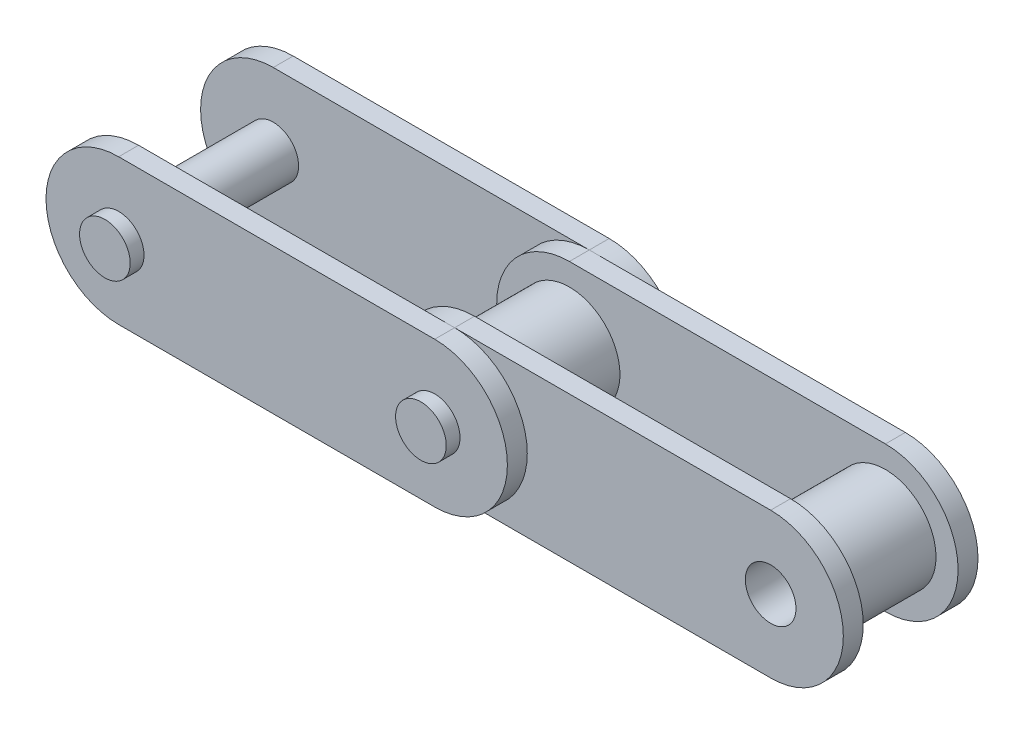
ISO-10303-21;
HEADER;
FILE_DESCRIPTION(('STEP AP214'),'2;1');
FILE_NAME('part.step','',(''),(''),'','','');
FILE_SCHEMA(('AUTOMOTIVE_DESIGN { 1 0 10303 214 1 1 1 1 }'));
ENDSEC;
DATA;
#1=APPLICATION_CONTEXT('core data for automotive mechanical design processes');
#2=APPLICATION_PROTOCOL_DEFINITION('international standard','automotive_design',2000,#1);
#3=PRODUCT_CONTEXT('',#1,'mechanical');
#4=PRODUCT('Part','Part','',(#3));
#5=PRODUCT_RELATED_PRODUCT_CATEGORY('part','',(#4));
#6=PRODUCT_DEFINITION_FORMATION('','',#4);
#7=PRODUCT_DEFINITION_CONTEXT('part definition',#1,'design');
#8=PRODUCT_DEFINITION('design','',#6,#7);
#9=PRODUCT_DEFINITION_SHAPE('','',#8);
#10=(LENGTH_UNIT() NAMED_UNIT(*) SI_UNIT(.MILLI.,.METRE.));
#11=(NAMED_UNIT(*) PLANE_ANGLE_UNIT() SI_UNIT($,.RADIAN.));
#12=(NAMED_UNIT(*) SI_UNIT($,.STERADIAN.) SOLID_ANGLE_UNIT());
#13=UNCERTAINTY_MEASURE_WITH_UNIT(LENGTH_MEASURE(1.E-05),#10,'distance_accuracy_value','');
#14=(GEOMETRIC_REPRESENTATION_CONTEXT(3) GLOBAL_UNCERTAINTY_ASSIGNED_CONTEXT((#13)) GLOBAL_UNIT_ASSIGNED_CONTEXT((#10,
#11,#12)) REPRESENTATION_CONTEXT('',''));
#15=CARTESIAN_POINT('',(0.,0.,0.));
#16=DIRECTION('',(0.,0.,1.));
#17=DIRECTION('',(1.,0.,0.));
#18=AXIS2_PLACEMENT_3D('',#15,#16,#17);
#19=CARTESIAN_POINT('',(698.5,0.,10.15));
#20=DIRECTION('',(0.,0.,-1.));
#21=DIRECTION('',(-1.,0.,0.));
#22=AXIS2_PLACEMENT_3D('',#19,#20,#21);
#23=PLANE('',#22);
#24=CARTESIAN_POINT('',(730.25,0.,10.15));
#25=DIRECTION('',(0.,0.,-1.));
#26=DIRECTION('',(-1.,0.,0.));
#27=AXIS2_PLACEMENT_3D('',#24,#25,#26);
#28=CIRCLE('',#27,2.545);
#29=CARTESIAN_POINT('',(727.705,0.,10.15));
#30=VERTEX_POINT('',#29);
#31=EDGE_CURVE('E20',#30,#30,#28,.T.);
#32=ORIENTED_EDGE('',*,*,#31,.F.);
#33=EDGE_LOOP('',(#32));
#34=FACE_BOUND('',#33,.T.);
#35=ADVANCED_FACE('F17',(#34),#23,.F.);
#36=CARTESIAN_POINT('',(698.5,0.,10.15));
#37=DIRECTION('',(0.,0.,-1.));
#38=DIRECTION('',(-1.,0.,0.));
#39=AXIS2_PLACEMENT_3D('',#36,#37,#38);
#40=PLANE('',#39);
#41=CARTESIAN_POINT('',(698.5,0.,10.15));
#42=DIRECTION('',(0.,0.,1.));
#43=DIRECTION('',(1.,0.,0.));
#44=AXIS2_PLACEMENT_3D('',#41,#42,#43);
#45=CIRCLE('',#44,2.545);
#46=CARTESIAN_POINT('',(701.045,0.,10.15));
#47=VERTEX_POINT('',#46);
#48=EDGE_CURVE('E256',#47,#47,#45,.F.);
#49=ORIENTED_EDGE('',*,*,#48,.F.);
#50=EDGE_LOOP('',(#49));
#51=FACE_BOUND('',#50,.T.);
#52=ADVANCED_FACE('F269',(#51),#40,.F.);
#53=CARTESIAN_POINT('',(730.25,0.,0.));
#54=DIRECTION('',(0.,0.,-1.));
#55=DIRECTION('',(-1.,0.,0.));
#56=AXIS2_PLACEMENT_3D('',#53,#54,#55);
#57=CYLINDRICAL_SURFACE('',#56,2.545);
#58=CARTESIAN_POINT('',(730.25,0.,8.765));
#59=DIRECTION('',(0.,0.,-1.));
#60=DIRECTION('',(-1.,0.,0.));
#61=AXIS2_PLACEMENT_3D('',#58,#59,#60);
#62=CIRCLE('',#61,2.545);
#63=CARTESIAN_POINT('',(727.705,0.,8.765));
#64=VERTEX_POINT('',#63);
#65=EDGE_CURVE('E254',#64,#64,#62,.F.);
#66=ORIENTED_EDGE('',*,*,#65,.T.);
#67=EDGE_LOOP('',(#66));
#68=FACE_BOUND('',#67,.T.);
#69=ORIENTED_EDGE('',*,*,#31,.T.);
#70=EDGE_LOOP('',(#69));
#71=FACE_BOUND('',#70,.T.);
#72=ADVANCED_FACE('F266',(#68,#71),#57,.T.);
#73=CARTESIAN_POINT('',(698.5,0.,0.));
#74=DIRECTION('',(0.,0.,1.));
#75=DIRECTION('',(1.,0.,0.));
#76=AXIS2_PLACEMENT_3D('',#73,#74,#75);
#77=CYLINDRICAL_SURFACE('',#76,2.545);
#78=ORIENTED_EDGE('',*,*,#48,.T.);
#79=EDGE_LOOP('',(#78));
#80=FACE_BOUND('',#79,.T.);
#81=CARTESIAN_POINT('',(698.5,0.,8.765));
#82=DIRECTION('',(0.,0.,1.));
#83=DIRECTION('',(1.,0.,0.));
#84=AXIS2_PLACEMENT_3D('',#81,#82,#83);
#85=CIRCLE('',#84,2.545);
#86=CARTESIAN_POINT('',(701.045,0.,8.765));
#87=VERTEX_POINT('',#86);
#88=EDGE_CURVE('E129',#87,#87,#85,.T.);
#89=ORIENTED_EDGE('',*,*,#88,.T.);
#90=EDGE_LOOP('',(#89));
#91=FACE_BOUND('',#90,.T.);
#92=ADVANCED_FACE('F401',(#80,#91),#77,.T.);
#93=CARTESIAN_POINT('',(698.5,0.,8.765));
#94=DIRECTION('',(0.,0.,-1.));
#95=DIRECTION('',(-1.,0.,0.));
#96=AXIS2_PLACEMENT_3D('',#93,#94,#95);
#97=PLANE('',#96);
#98=ORIENTED_EDGE('',*,*,#88,.F.);
#99=EDGE_LOOP('',(#98));
#100=FACE_BOUND('',#99,.T.);
#101=CARTESIAN_POINT('',(698.5,0.,8.765));
#102=DIRECTION('',(0.,0.,-1.));
#103=DIRECTION('',(-1.,0.,0.));
#104=AXIS2_PLACEMENT_3D('',#101,#102,#103);
#105=CIRCLE('',#104,7.3);
#106=CARTESIAN_POINT('',(698.5,-7.3,8.765));
#107=VERTEX_POINT('',#106);
#108=CARTESIAN_POINT('',(698.5,7.3,8.765));
#109=VERTEX_POINT('',#108);
#110=EDGE_CURVE('E246',#107,#109,#105,.T.);
#111=ORIENTED_EDGE('',*,*,#110,.F.);
#112=DIRECTION('',(1.,0.,0.));
#113=VECTOR('',#112,1.);
#114=CARTESIAN_POINT('',(730.25,-7.3,8.765));
#115=LINE('',#114,#113);
#116=CARTESIAN_POINT('',(730.25,-7.3,8.765));
#117=VERTEX_POINT('',#116);
#118=EDGE_CURVE('E128',#117,#107,#115,.F.);
#119=ORIENTED_EDGE('',*,*,#118,.F.);
#120=CARTESIAN_POINT('',(730.25,0.,8.765));
#121=DIRECTION('',(0.,0.,-1.));
#122=DIRECTION('',(-1.,0.,0.));
#123=AXIS2_PLACEMENT_3D('',#120,#121,#122);
#124=CIRCLE('',#123,7.3);
#125=CARTESIAN_POINT('',(730.25,7.3,8.765));
#126=VERTEX_POINT('',#125);
#127=EDGE_CURVE('E240',#126,#117,#124,.T.);
#128=ORIENTED_EDGE('',*,*,#127,.F.);
#129=DIRECTION('',(1.,0.,0.));
#130=VECTOR('',#129,1.);
#131=CARTESIAN_POINT('',(698.5,7.3,8.765));
#132=LINE('',#131,#130);
#133=EDGE_CURVE('E148',#109,#126,#132,.T.);
#134=ORIENTED_EDGE('',*,*,#133,.F.);
#135=EDGE_LOOP('',(#111,#119,#128,#134));
#136=FACE_BOUND('',#135,.T.);
#137=ORIENTED_EDGE('',*,*,#65,.F.);
#138=EDGE_LOOP('',(#137));
#139=FACE_BOUND('',#138,.T.);
#140=ADVANCED_FACE('F398',(#100,#136,#139),#97,.F.);
#141=CARTESIAN_POINT('',(698.5,0.,4.765));
#142=DIRECTION('',(0.,0.,-1.));
#143=DIRECTION('',(-1.,0.,0.));
#144=AXIS2_PLACEMENT_3D('',#141,#142,#143);
#145=PLANE('',#144);
#146=DIRECTION('',(1.,0.,0.));
#147=VECTOR('',#146,1.);
#148=CARTESIAN_POINT('',(762.,7.3,4.765));
#149=LINE('',#148,#147);
#150=CARTESIAN_POINT('',(762.,7.3,4.765));
#151=VERTEX_POINT('',#150);
#152=CARTESIAN_POINT('',(730.25,7.3,4.765));
#153=VERTEX_POINT('',#152);
#154=EDGE_CURVE('E122',#151,#153,#149,.F.);
#155=ORIENTED_EDGE('',*,*,#154,.F.);
#156=CARTESIAN_POINT('',(762.,0.,4.765));
#157=DIRECTION('',(0.,0.,1.));
#158=DIRECTION('',(1.,0.,0.));
#159=AXIS2_PLACEMENT_3D('',#156,#157,#158);
#160=CIRCLE('',#159,7.3);
#161=CARTESIAN_POINT('',(762.,-7.3,4.765));
#162=VERTEX_POINT('',#161);
#163=EDGE_CURVE('E139',#162,#151,#160,.T.);
#164=ORIENTED_EDGE('',*,*,#163,.F.);
#165=DIRECTION('',(1.,0.,0.));
#166=VECTOR('',#165,1.);
#167=CARTESIAN_POINT('',(730.25,-7.3,4.765));
#168=LINE('',#167,#166);
#169=CARTESIAN_POINT('',(730.25,-7.3,4.765));
#170=VERTEX_POINT('',#169);
#171=EDGE_CURVE('E125',#170,#162,#168,.T.);
#172=ORIENTED_EDGE('',*,*,#171,.F.);
#173=CARTESIAN_POINT('',(730.25,0.,4.765));
#174=DIRECTION('',(0.,0.,1.));
#175=DIRECTION('',(1.,0.,0.));
#176=AXIS2_PLACEMENT_3D('',#173,#174,#175);
#177=CIRCLE('',#176,7.3);
#178=EDGE_CURVE('E117',#153,#170,#177,.T.);
#179=ORIENTED_EDGE('',*,*,#178,.F.);
#180=EDGE_LOOP('',(#155,#164,#172,#179));
#181=FACE_BOUND('',#180,.T.);
#182=CARTESIAN_POINT('',(762.,0.,4.765));
#183=DIRECTION('',(0.,0.,-1.));
#184=DIRECTION('',(-1.,0.,0.));
#185=AXIS2_PLACEMENT_3D('',#182,#183,#184);
#186=CIRCLE('',#185,5.08);
#187=CARTESIAN_POINT('',(756.92,0.,4.765));
#188=VERTEX_POINT('',#187);
#189=EDGE_CURVE('E233',#188,#188,#186,.T.);
#190=ORIENTED_EDGE('',*,*,#189,.F.);
#191=EDGE_LOOP('',(#190));
#192=FACE_BOUND('',#191,.T.);
#193=CARTESIAN_POINT('',(730.25,0.,4.765));
#194=DIRECTION('',(0.,0.,-1.));
#195=DIRECTION('',(-1.,0.,0.));
#196=AXIS2_PLACEMENT_3D('',#193,#194,#195);
#197=CIRCLE('',#196,5.08);
#198=CARTESIAN_POINT('',(725.17,0.,4.765));
#199=VERTEX_POINT('',#198);
#200=EDGE_CURVE('E236',#199,#199,#197,.T.);
#201=ORIENTED_EDGE('',*,*,#200,.F.);
#202=EDGE_LOOP('',(#201));
#203=FACE_BOUND('',#202,.T.);
#204=ADVANCED_FACE('F119',(#181,#192,#203),#145,.T.);
#205=CARTESIAN_POINT('',(730.25,0.,6.765));
#206=DIRECTION('',(0.,0.,1.));
#207=DIRECTION('',(1.,0.,0.));
#208=AXIS2_PLACEMENT_3D('',#205,#206,#207);
#209=CYLINDRICAL_SURFACE('',#208,7.3);
#210=CARTESIAN_POINT('',(730.25,0.,6.765));
#211=DIRECTION('',(0.,0.,1.));
#212=DIRECTION('',(1.,0.,0.));
#213=AXIS2_PLACEMENT_3D('',#210,#211,#212);
#214=CIRCLE('',#213,7.3);
#215=CARTESIAN_POINT('',(730.25,7.3,6.765));
#216=VERTEX_POINT('',#215);
#217=CARTESIAN_POINT('',(730.25,-7.3,6.765));
#218=VERTEX_POINT('',#217);
#219=EDGE_CURVE('E136',#216,#218,#214,.T.);
#220=ORIENTED_EDGE('',*,*,#219,.F.);
#221=DIRECTION('',(0.,0.,1.));
#222=VECTOR('',#221,1.);
#223=CARTESIAN_POINT('',(730.25,7.3,6.765));
#224=LINE('',#223,#222);
#225=EDGE_CURVE('E133',#153,#216,#224,.T.);
#226=ORIENTED_EDGE('',*,*,#225,.F.);
#227=ORIENTED_EDGE('',*,*,#178,.T.);
#228=DIRECTION('',(0.,0.,-1.));
#229=VECTOR('',#228,1.);
#230=CARTESIAN_POINT('',(730.25,-7.3,6.765));
#231=LINE('',#230,#229);
#232=EDGE_CURVE('E244',#218,#170,#231,.T.);
#233=ORIENTED_EDGE('',*,*,#232,.F.);
#234=EDGE_LOOP('',(#220,#226,#227,#233));
#235=FACE_BOUND('',#234,.T.);
#236=ADVANCED_FACE('F134',(#235),#209,.T.);
#237=CARTESIAN_POINT('',(730.25,-7.3,6.765));
#238=DIRECTION('',(0.,-1.,0.));
#239=DIRECTION('',(0.,0.,-1.));
#240=AXIS2_PLACEMENT_3D('',#237,#238,#239);
#241=PLANE('',#240);
#242=DIRECTION('',(-1.,0.,0.));
#243=VECTOR('',#242,1.);
#244=CARTESIAN_POINT('',(698.5,-7.3,6.765));
#245=LINE('',#244,#243);
#246=CARTESIAN_POINT('',(698.5,-7.3,6.765));
#247=VERTEX_POINT('',#246);
#248=EDGE_CURVE('E231',#218,#247,#245,.T.);
#249=ORIENTED_EDGE('',*,*,#248,.F.);
#250=DIRECTION('',(0.,0.,-1.));
#251=VECTOR('',#250,1.);
#252=CARTESIAN_POINT('',(730.25,-7.3,6.765));
#253=LINE('',#252,#251);
#254=EDGE_CURVE('E243',#117,#218,#253,.T.);
#255=ORIENTED_EDGE('',*,*,#254,.F.);
#256=ORIENTED_EDGE('',*,*,#118,.T.);
#257=DIRECTION('',(0.,0.,-1.));
#258=VECTOR('',#257,1.);
#259=CARTESIAN_POINT('',(698.5,-7.3,6.765));
#260=LINE('',#259,#258);
#261=EDGE_CURVE('E249',#247,#107,#260,.F.);
#262=ORIENTED_EDGE('',*,*,#261,.F.);
#263=EDGE_LOOP('',(#249,#255,#256,#262));
#264=FACE_BOUND('',#263,.T.);
#265=ADVANCED_FACE('F389',(#264),#241,.T.);
#266=CARTESIAN_POINT('',(698.5,0.,6.765));
#267=DIRECTION('',(0.,0.,-1.));
#268=DIRECTION('',(-1.,0.,0.));
#269=AXIS2_PLACEMENT_3D('',#266,#267,#268);
#270=CYLINDRICAL_SURFACE('',#269,7.3);
#271=CARTESIAN_POINT('',(698.5,0.,6.765));
#272=DIRECTION('',(0.,0.,-1.));
#273=DIRECTION('',(-1.,0.,0.));
#274=AXIS2_PLACEMENT_3D('',#271,#272,#273);
#275=CIRCLE('',#274,7.3);
#276=CARTESIAN_POINT('',(698.5,7.3,6.765));
#277=VERTEX_POINT('',#276);
#278=EDGE_CURVE('E227',#247,#277,#275,.T.);
#279=ORIENTED_EDGE('',*,*,#278,.F.);
#280=ORIENTED_EDGE('',*,*,#261,.T.);
#281=ORIENTED_EDGE('',*,*,#110,.T.);
#282=DIRECTION('',(0.,0.,1.));
#283=VECTOR('',#282,1.);
#284=CARTESIAN_POINT('',(698.5,7.3,6.765));
#285=LINE('',#284,#283);
#286=EDGE_CURVE('E145',#277,#109,#285,.T.);
#287=ORIENTED_EDGE('',*,*,#286,.F.);
#288=EDGE_LOOP('',(#279,#280,#281,#287));
#289=FACE_BOUND('',#288,.T.);
#290=ADVANCED_FACE('F385',(#289),#270,.T.);
#291=CARTESIAN_POINT('',(698.5,7.3,6.765));
#292=DIRECTION('',(0.,1.,0.));
#293=DIRECTION('',(0.,0.,1.));
#294=AXIS2_PLACEMENT_3D('',#291,#292,#293);
#295=PLANE('',#294);
#296=DIRECTION('',(-1.,0.,0.));
#297=VECTOR('',#296,1.);
#298=CARTESIAN_POINT('',(698.5,7.3,6.765));
#299=LINE('',#298,#297);
#300=EDGE_CURVE('E230',#277,#216,#299,.F.);
#301=ORIENTED_EDGE('',*,*,#300,.F.);
#302=ORIENTED_EDGE('',*,*,#286,.T.);
#303=ORIENTED_EDGE('',*,*,#133,.T.);
#304=DIRECTION('',(0.,0.,-1.));
#305=VECTOR('',#304,1.);
#306=CARTESIAN_POINT('',(730.25,7.3,6.765));
#307=LINE('',#306,#305);
#308=EDGE_CURVE('E239',#216,#126,#307,.F.);
#309=ORIENTED_EDGE('',*,*,#308,.F.);
#310=EDGE_LOOP('',(#301,#302,#303,#309));
#311=FACE_BOUND('',#310,.T.);
#312=ADVANCED_FACE('F382',(#311),#295,.T.);
#313=CARTESIAN_POINT('',(762.,7.3,6.765));
#314=DIRECTION('',(0.,1.,0.));
#315=DIRECTION('',(0.,0.,1.));
#316=AXIS2_PLACEMENT_3D('',#313,#314,#315);
#317=PLANE('',#316);
#318=DIRECTION('',(-1.,0.,0.));
#319=VECTOR('',#318,1.);
#320=CARTESIAN_POINT('',(698.5,7.3,6.765));
#321=LINE('',#320,#319);
#322=CARTESIAN_POINT('',(762.,7.3,6.765));
#323=VERTEX_POINT('',#322);
#324=EDGE_CURVE('E226',#216,#323,#321,.F.);
#325=ORIENTED_EDGE('',*,*,#324,.T.);
#326=DIRECTION('',(0.,0.,1.));
#327=VECTOR('',#326,1.);
#328=CARTESIAN_POINT('',(762.,7.3,6.765));
#329=LINE('',#328,#327);
#330=EDGE_CURVE('E143',#151,#323,#329,.T.);
#331=ORIENTED_EDGE('',*,*,#330,.F.);
#332=ORIENTED_EDGE('',*,*,#154,.T.);
#333=ORIENTED_EDGE('',*,*,#225,.T.);
#334=EDGE_LOOP('',(#325,#331,#332,#333));
#335=FACE_BOUND('',#334,.T.);
#336=ADVANCED_FACE('F141',(#335),#317,.T.);
#337=CARTESIAN_POINT('',(762.,0.,6.765));
#338=DIRECTION('',(0.,0.,1.));
#339=DIRECTION('',(1.,0.,0.));
#340=AXIS2_PLACEMENT_3D('',#337,#338,#339);
#341=CYLINDRICAL_SURFACE('',#340,7.3);
#342=CARTESIAN_POINT('',(762.,0.,6.765));
#343=DIRECTION('',(0.,0.,1.));
#344=DIRECTION('',(1.,0.,0.));
#345=AXIS2_PLACEMENT_3D('',#342,#343,#344);
#346=CIRCLE('',#345,7.3);
#347=CARTESIAN_POINT('',(762.,-7.3,6.765));
#348=VERTEX_POINT('',#347);
#349=EDGE_CURVE('E224',#323,#348,#346,.F.);
#350=ORIENTED_EDGE('',*,*,#349,.T.);
#351=DIRECTION('',(0.,0.,-1.));
#352=VECTOR('',#351,1.);
#353=CARTESIAN_POINT('',(762.,-7.3,6.765));
#354=LINE('',#353,#352);
#355=EDGE_CURVE('E655',#162,#348,#354,.F.);
#356=ORIENTED_EDGE('',*,*,#355,.F.);
#357=ORIENTED_EDGE('',*,*,#163,.T.);
#358=ORIENTED_EDGE('',*,*,#330,.T.);
#359=EDGE_LOOP('',(#350,#356,#357,#358));
#360=FACE_BOUND('',#359,.T.);
#361=ADVANCED_FACE('F375',(#360),#341,.T.);
#362=CARTESIAN_POINT('',(730.25,-7.3,6.765));
#363=DIRECTION('',(0.,-1.,0.));
#364=DIRECTION('',(0.,0.,-1.));
#365=AXIS2_PLACEMENT_3D('',#362,#363,#364);
#366=PLANE('',#365);
#367=DIRECTION('',(-1.,0.,0.));
#368=VECTOR('',#367,1.);
#369=CARTESIAN_POINT('',(698.5,-7.3,6.765));
#370=LINE('',#369,#368);
#371=EDGE_CURVE('E223',#348,#218,#370,.T.);
#372=ORIENTED_EDGE('',*,*,#371,.T.);
#373=ORIENTED_EDGE('',*,*,#232,.T.);
#374=ORIENTED_EDGE('',*,*,#171,.T.);
#375=ORIENTED_EDGE('',*,*,#355,.T.);
#376=EDGE_LOOP('',(#372,#373,#374,#375));
#377=FACE_BOUND('',#376,.T.);
#378=ADVANCED_FACE('F371',(#377),#366,.T.);
#379=CARTESIAN_POINT('',(730.25,0.,6.765));
#380=DIRECTION('',(0.,0.,-1.));
#381=DIRECTION('',(-1.,0.,0.));
#382=AXIS2_PLACEMENT_3D('',#379,#380,#381);
#383=CYLINDRICAL_SURFACE('',#382,7.3);
#384=CARTESIAN_POINT('',(730.25,0.,6.765));
#385=DIRECTION('',(0.,0.,-1.));
#386=DIRECTION('',(-1.,0.,0.));
#387=AXIS2_PLACEMENT_3D('',#384,#385,#386);
#388=CIRCLE('',#387,7.3);
#389=EDGE_CURVE('E221',#218,#216,#388,.F.);
#390=ORIENTED_EDGE('',*,*,#389,.T.);
#391=ORIENTED_EDGE('',*,*,#308,.T.);
#392=ORIENTED_EDGE('',*,*,#127,.T.);
#393=ORIENTED_EDGE('',*,*,#254,.T.);
#394=EDGE_LOOP('',(#390,#391,#392,#393));
#395=FACE_BOUND('',#394,.T.);
#396=ADVANCED_FACE('F367',(#395),#383,.T.);
#397=CARTESIAN_POINT('',(730.25,0.,-4.765));
#398=DIRECTION('',(0.,0.,-1.));
#399=DIRECTION('',(-1.,0.,0.));
#400=AXIS2_PLACEMENT_3D('',#397,#398,#399);
#401=CYLINDRICAL_SURFACE('',#400,5.08);
#402=ORIENTED_EDGE('',*,*,#200,.T.);
#403=EDGE_LOOP('',(#402));
#404=FACE_BOUND('',#403,.T.);
#405=CARTESIAN_POINT('',(730.25,0.,-4.765));
#406=DIRECTION('',(0.,0.,-1.));
#407=DIRECTION('',(-1.,0.,0.));
#408=AXIS2_PLACEMENT_3D('',#405,#406,#407);
#409=CIRCLE('',#408,5.08);
#410=CARTESIAN_POINT('',(725.17,0.,-4.765));
#411=VERTEX_POINT('',#410);
#412=EDGE_CURVE('E217',#411,#411,#409,.F.);
#413=ORIENTED_EDGE('',*,*,#412,.T.);
#414=EDGE_LOOP('',(#413));
#415=FACE_BOUND('',#414,.T.);
#416=ADVANCED_FACE('F363',(#404,#415),#401,.T.);
#417=CARTESIAN_POINT('',(762.,0.,-4.765));
#418=DIRECTION('',(0.,0.,-1.));
#419=DIRECTION('',(-1.,0.,0.));
#420=AXIS2_PLACEMENT_3D('',#417,#418,#419);
#421=CYLINDRICAL_SURFACE('',#420,5.08);
#422=ORIENTED_EDGE('',*,*,#189,.T.);
#423=EDGE_LOOP('',(#422));
#424=FACE_BOUND('',#423,.T.);
#425=CARTESIAN_POINT('',(762.,0.,-4.765));
#426=DIRECTION('',(0.,0.,-1.));
#427=DIRECTION('',(-1.,0.,0.));
#428=AXIS2_PLACEMENT_3D('',#425,#426,#427);
#429=CIRCLE('',#428,5.08);
#430=CARTESIAN_POINT('',(756.92,0.,-4.765));
#431=VERTEX_POINT('',#430);
#432=EDGE_CURVE('E213',#431,#431,#429,.F.);
#433=ORIENTED_EDGE('',*,*,#432,.T.);
#434=EDGE_LOOP('',(#433));
#435=FACE_BOUND('',#434,.T.);
#436=ADVANCED_FACE('F359',(#424,#435),#421,.T.);
#437=CARTESIAN_POINT('',(698.5,0.,6.765));
#438=DIRECTION('',(0.,0.,-1.));
#439=DIRECTION('',(-1.,0.,0.));
#440=AXIS2_PLACEMENT_3D('',#437,#438,#439);
#441=PLANE('',#440);
#442=CARTESIAN_POINT('',(698.5,0.,6.765));
#443=DIRECTION('',(0.,0.,1.));
#444=DIRECTION('',(1.,0.,0.));
#445=AXIS2_PLACEMENT_3D('',#442,#443,#444);
#446=CIRCLE('',#445,2.545);
#447=CARTESIAN_POINT('',(701.045,0.,6.765));
#448=VERTEX_POINT('',#447);
#449=EDGE_CURVE('E206',#448,#448,#446,.F.);
#450=ORIENTED_EDGE('',*,*,#449,.F.);
#451=EDGE_LOOP('',(#450));
#452=FACE_BOUND('',#451,.T.);
#453=ORIENTED_EDGE('',*,*,#278,.T.);
#454=ORIENTED_EDGE('',*,*,#300,.T.);
#455=ORIENTED_EDGE('',*,*,#219,.T.);
#456=ORIENTED_EDGE('',*,*,#248,.T.);
#457=EDGE_LOOP('',(#453,#454,#455,#456));
#458=FACE_BOUND('',#457,.T.);
#459=ADVANCED_FACE('F355',(#452,#458),#441,.T.);
#460=CARTESIAN_POINT('',(698.5,0.,6.765));
#461=DIRECTION('',(0.,0.,-1.));
#462=DIRECTION('',(-1.,0.,0.));
#463=AXIS2_PLACEMENT_3D('',#460,#461,#462);
#464=PLANE('',#463);
#465=ORIENTED_EDGE('',*,*,#371,.F.);
#466=ORIENTED_EDGE('',*,*,#349,.F.);
#467=ORIENTED_EDGE('',*,*,#324,.F.);
#468=ORIENTED_EDGE('',*,*,#389,.F.);
#469=EDGE_LOOP('',(#465,#466,#467,#468));
#470=FACE_BOUND('',#469,.T.);
#471=CARTESIAN_POINT('',(762.,0.,6.765));
#472=DIRECTION('',(0.,0.,-1.));
#473=DIRECTION('',(-1.,0.,0.));
#474=AXIS2_PLACEMENT_3D('',#471,#472,#473);
#475=CIRCLE('',#474,2.545);
#476=CARTESIAN_POINT('',(759.455,0.,6.765));
#477=VERTEX_POINT('',#476);
#478=EDGE_CURVE('E202',#477,#477,#475,.T.);
#479=ORIENTED_EDGE('',*,*,#478,.T.);
#480=EDGE_LOOP('',(#479));
#481=FACE_BOUND('',#480,.T.);
#482=ADVANCED_FACE('F351',(#470,#481),#464,.F.);
#483=CARTESIAN_POINT('',(698.5,0.,-4.765));
#484=DIRECTION('',(0.,0.,-1.));
#485=DIRECTION('',(-1.,0.,0.));
#486=AXIS2_PLACEMENT_3D('',#483,#484,#485);
#487=PLANE('',#486);
#488=CARTESIAN_POINT('',(730.25,0.,-4.765));
#489=DIRECTION('',(0.,0.,-1.));
#490=DIRECTION('',(-1.,0.,0.));
#491=AXIS2_PLACEMENT_3D('',#488,#489,#490);
#492=CIRCLE('',#491,7.3);
#493=CARTESIAN_POINT('',(730.25,-7.3,-4.765));
#494=VERTEX_POINT('',#493);
#495=CARTESIAN_POINT('',(730.25,7.3,-4.765));
#496=VERTEX_POINT('',#495);
#497=EDGE_CURVE('E210',#494,#496,#492,.T.);
#498=ORIENTED_EDGE('',*,*,#497,.F.);
#499=DIRECTION('',(1.,0.,0.));
#500=VECTOR('',#499,1.);
#501=CARTESIAN_POINT('',(762.,-7.3,-4.765));
#502=LINE('',#501,#500);
#503=CARTESIAN_POINT('',(762.,-7.3,-4.765));
#504=VERTEX_POINT('',#503);
#505=EDGE_CURVE('E669',#504,#494,#502,.F.);
#506=ORIENTED_EDGE('',*,*,#505,.F.);
#507=CARTESIAN_POINT('',(762.,0.,-4.765));
#508=DIRECTION('',(0.,0.,-1.));
#509=DIRECTION('',(-1.,0.,0.));
#510=AXIS2_PLACEMENT_3D('',#507,#508,#509);
#511=CIRCLE('',#510,7.3);
#512=CARTESIAN_POINT('',(762.,7.3,-4.765));
#513=VERTEX_POINT('',#512);
#514=EDGE_CURVE('E197',#513,#504,#511,.T.);
#515=ORIENTED_EDGE('',*,*,#514,.F.);
#516=DIRECTION('',(1.,0.,0.));
#517=VECTOR('',#516,1.);
#518=CARTESIAN_POINT('',(730.25,7.3,-4.765));
#519=LINE('',#518,#517);
#520=EDGE_CURVE('E205',#496,#513,#519,.T.);
#521=ORIENTED_EDGE('',*,*,#520,.F.);
#522=EDGE_LOOP('',(#498,#506,#515,#521));
#523=FACE_BOUND('',#522,.T.);
#524=ORIENTED_EDGE('',*,*,#432,.F.);
#525=EDGE_LOOP('',(#524));
#526=FACE_BOUND('',#525,.T.);
#527=ORIENTED_EDGE('',*,*,#412,.F.);
#528=EDGE_LOOP('',(#527));
#529=FACE_BOUND('',#528,.T.);
#530=ADVANCED_FACE('F347',(#523,#526,#529),#487,.F.);
#531=CARTESIAN_POINT('',(730.25,0.,-6.765));
#532=DIRECTION('',(0.,0.,-1.));
#533=DIRECTION('',(-1.,0.,0.));
#534=AXIS2_PLACEMENT_3D('',#531,#532,#533);
#535=CYLINDRICAL_SURFACE('',#534,7.3);
#536=CARTESIAN_POINT('',(730.25,0.,-6.765));
#537=DIRECTION('',(0.,0.,-1.));
#538=DIRECTION('',(-1.,0.,0.));
#539=AXIS2_PLACEMENT_3D('',#536,#537,#538);
#540=CIRCLE('',#539,7.3);
#541=CARTESIAN_POINT('',(730.25,7.3,-6.765));
#542=VERTEX_POINT('',#541);
#543=CARTESIAN_POINT('',(730.25,-7.3,-6.765));
#544=VERTEX_POINT('',#543);
#545=EDGE_CURVE('E194',#542,#544,#540,.F.);
#546=ORIENTED_EDGE('',*,*,#545,.T.);
#547=DIRECTION('',(0.,0.,-1.));
#548=VECTOR('',#547,1.);
#549=CARTESIAN_POINT('',(730.25,-7.3,-6.765));
#550=LINE('',#549,#548);
#551=EDGE_CURVE('E672',#494,#544,#550,.T.);
#552=ORIENTED_EDGE('',*,*,#551,.F.);
#553=ORIENTED_EDGE('',*,*,#497,.T.);
#554=DIRECTION('',(0.,0.,1.));
#555=VECTOR('',#554,1.);
#556=CARTESIAN_POINT('',(730.25,7.3,-6.765));
#557=LINE('',#556,#555);
#558=EDGE_CURVE('E201',#542,#496,#557,.T.);
#559=ORIENTED_EDGE('',*,*,#558,.F.);
#560=EDGE_LOOP('',(#546,#552,#553,#559));
#561=FACE_BOUND('',#560,.T.);
#562=ADVANCED_FACE('F343',(#561),#535,.T.);
#563=CARTESIAN_POINT('',(698.5,0.,0.));
#564=DIRECTION('',(0.,0.,1.));
#565=DIRECTION('',(1.,0.,0.));
#566=AXIS2_PLACEMENT_3D('',#563,#564,#565);
#567=CYLINDRICAL_SURFACE('',#566,2.545);
#568=ORIENTED_EDGE('',*,*,#449,.T.);
#569=EDGE_LOOP('',(#568));
#570=FACE_BOUND('',#569,.T.);
#571=CARTESIAN_POINT('',(698.5,0.,-6.765));
#572=DIRECTION('',(0.,0.,1.));
#573=DIRECTION('',(1.,0.,0.));
#574=AXIS2_PLACEMENT_3D('',#571,#572,#573);
#575=CIRCLE('',#574,2.545);
#576=CARTESIAN_POINT('',(701.045,0.,-6.765));
#577=VERTEX_POINT('',#576);
#578=EDGE_CURVE('E190',#577,#577,#575,.T.);
#579=ORIENTED_EDGE('',*,*,#578,.T.);
#580=EDGE_LOOP('',(#579));
#581=FACE_BOUND('',#580,.T.);
#582=ADVANCED_FACE('F339',(#570,#581),#567,.T.);
#583=CARTESIAN_POINT('',(762.,0.,-9.53));
#584=DIRECTION('',(0.,0.,-1.));
#585=DIRECTION('',(-1.,0.,0.));
#586=AXIS2_PLACEMENT_3D('',#583,#584,#585);
#587=CYLINDRICAL_SURFACE('',#586,2.545);
#588=ORIENTED_EDGE('',*,*,#478,.F.);
#589=EDGE_LOOP('',(#588));
#590=FACE_BOUND('',#589,.T.);
#591=CARTESIAN_POINT('',(762.,0.,-6.765));
#592=DIRECTION('',(0.,0.,-1.));
#593=DIRECTION('',(-1.,0.,0.));
#594=AXIS2_PLACEMENT_3D('',#591,#592,#593);
#595=CIRCLE('',#594,2.545);
#596=CARTESIAN_POINT('',(759.455,0.,-6.765));
#597=VERTEX_POINT('',#596);
#598=EDGE_CURVE('E186',#597,#597,#595,.F.);
#599=ORIENTED_EDGE('',*,*,#598,.F.);
#600=EDGE_LOOP('',(#599));
#601=FACE_BOUND('',#600,.T.);
#602=ADVANCED_FACE('F335',(#590,#601),#587,.F.);
#603=CARTESIAN_POINT('',(730.25,7.3,-6.765));
#604=DIRECTION('',(0.,1.,0.));
#605=DIRECTION('',(0.,0.,1.));
#606=AXIS2_PLACEMENT_3D('',#603,#604,#605);
#607=PLANE('',#606);
#608=DIRECTION('',(-1.,0.,0.));
#609=VECTOR('',#608,1.);
#610=CARTESIAN_POINT('',(698.5,7.3,-6.765));
#611=LINE('',#610,#609);
#612=CARTESIAN_POINT('',(762.,7.3,-6.765));
#613=VERTEX_POINT('',#612);
#614=EDGE_CURVE('E185',#542,#613,#611,.F.);
#615=ORIENTED_EDGE('',*,*,#614,.F.);
#616=ORIENTED_EDGE('',*,*,#558,.T.);
#617=ORIENTED_EDGE('',*,*,#520,.T.);
#618=DIRECTION('',(0.,0.,-1.));
#619=VECTOR('',#618,1.);
#620=CARTESIAN_POINT('',(762.,7.3,-6.765));
#621=LINE('',#620,#619);
#622=EDGE_CURVE('E200',#613,#513,#621,.F.);
#623=ORIENTED_EDGE('',*,*,#622,.F.);
#624=EDGE_LOOP('',(#615,#616,#617,#623));
#625=FACE_BOUND('',#624,.T.);
#626=ADVANCED_FACE('F331',(#625),#607,.T.);
#627=CARTESIAN_POINT('',(762.,0.,-6.765));
#628=DIRECTION('',(0.,0.,-1.));
#629=DIRECTION('',(-1.,0.,0.));
#630=AXIS2_PLACEMENT_3D('',#627,#628,#629);
#631=CYLINDRICAL_SURFACE('',#630,7.3);
#632=CARTESIAN_POINT('',(762.,0.,-6.765));
#633=DIRECTION('',(0.,0.,-1.));
#634=DIRECTION('',(-1.,0.,0.));
#635=AXIS2_PLACEMENT_3D('',#632,#633,#634);
#636=CIRCLE('',#635,7.3);
#637=CARTESIAN_POINT('',(762.,-7.3,-6.765));
#638=VERTEX_POINT('',#637);
#639=EDGE_CURVE('E182',#613,#638,#636,.T.);
#640=ORIENTED_EDGE('',*,*,#639,.F.);
#641=ORIENTED_EDGE('',*,*,#622,.T.);
#642=ORIENTED_EDGE('',*,*,#514,.T.);
#643=DIRECTION('',(0.,0.,-1.));
#644=VECTOR('',#643,1.);
#645=CARTESIAN_POINT('',(762.,-7.3,-6.765));
#646=LINE('',#645,#644);
#647=EDGE_CURVE('E196',#638,#504,#646,.F.);
#648=ORIENTED_EDGE('',*,*,#647,.F.);
#649=EDGE_LOOP('',(#640,#641,#642,#648));
#650=FACE_BOUND('',#649,.T.);
#651=ADVANCED_FACE('F327',(#650),#631,.T.);
#652=CARTESIAN_POINT('',(762.,-7.3,-6.765));
#653=DIRECTION('',(0.,-1.,0.));
#654=DIRECTION('',(0.,0.,-1.));
#655=AXIS2_PLACEMENT_3D('',#652,#653,#654);
#656=PLANE('',#655);
#657=DIRECTION('',(-1.,0.,0.));
#658=VECTOR('',#657,1.);
#659=CARTESIAN_POINT('',(698.5,-7.3,-6.765));
#660=LINE('',#659,#658);
#661=EDGE_CURVE('E181',#638,#544,#660,.T.);
#662=ORIENTED_EDGE('',*,*,#661,.F.);
#663=ORIENTED_EDGE('',*,*,#647,.T.);
#664=ORIENTED_EDGE('',*,*,#505,.T.);
#665=ORIENTED_EDGE('',*,*,#551,.T.);
#666=EDGE_LOOP('',(#662,#663,#664,#665));
#667=FACE_BOUND('',#666,.T.);
#668=ADVANCED_FACE('F323',(#667),#656,.T.);
#669=CARTESIAN_POINT('',(698.5,0.,-11.6));
#670=DIRECTION('',(0.,0.,-1.));
#671=DIRECTION('',(-1.,0.,0.));
#672=AXIS2_PLACEMENT_3D('',#669,#670,#671);
#673=PLANE('',#672);
#674=CARTESIAN_POINT('',(730.25,0.,-11.6));
#675=DIRECTION('',(0.,0.,1.));
#676=DIRECTION('',(1.,0.,0.));
#677=AXIS2_PLACEMENT_3D('',#674,#675,#676);
#678=CIRCLE('',#677,2.545);
#679=CARTESIAN_POINT('',(732.795,0.,-11.6));
#680=VERTEX_POINT('',#679);
#681=EDGE_CURVE('E176',#680,#680,#678,.T.);
#682=ORIENTED_EDGE('',*,*,#681,.F.);
#683=EDGE_LOOP('',(#682));
#684=FACE_BOUND('',#683,.T.);
#685=ADVANCED_FACE('F319',(#684),#673,.T.);
#686=CARTESIAN_POINT('',(698.5,0.,-6.765));
#687=DIRECTION('',(0.,0.,-1.));
#688=DIRECTION('',(-1.,0.,0.));
#689=AXIS2_PLACEMENT_3D('',#686,#687,#688);
#690=PLANE('',#689);
#691=ORIENTED_EDGE('',*,*,#578,.F.);
#692=EDGE_LOOP('',(#691));
#693=FACE_BOUND('',#692,.T.);
#694=DIRECTION('',(1.,0.,0.));
#695=VECTOR('',#694,1.);
#696=CARTESIAN_POINT('',(730.25,7.3,-6.765));
#697=LINE('',#696,#695);
#698=CARTESIAN_POINT('',(698.5,7.3,-6.765));
#699=VERTEX_POINT('',#698);
#700=EDGE_CURVE('E681',#699,#542,#697,.T.);
#701=ORIENTED_EDGE('',*,*,#700,.F.);
#702=CARTESIAN_POINT('',(698.5,0.,-6.765));
#703=DIRECTION('',(0.,0.,1.));
#704=DIRECTION('',(1.,0.,0.));
#705=AXIS2_PLACEMENT_3D('',#702,#703,#704);
#706=CIRCLE('',#705,7.3);
#707=CARTESIAN_POINT('',(698.5,-7.3,-6.765));
#708=VERTEX_POINT('',#707);
#709=EDGE_CURVE('E172',#708,#699,#706,.F.);
#710=ORIENTED_EDGE('',*,*,#709,.F.);
#711=DIRECTION('',(1.,0.,0.));
#712=VECTOR('',#711,1.);
#713=CARTESIAN_POINT('',(698.5,-7.3,-6.765));
#714=LINE('',#713,#712);
#715=EDGE_CURVE('E180',#544,#708,#714,.F.);
#716=ORIENTED_EDGE('',*,*,#715,.F.);
#717=ORIENTED_EDGE('',*,*,#545,.F.);
#718=EDGE_LOOP('',(#701,#710,#716,#717));
#719=FACE_BOUND('',#718,.T.);
#720=ADVANCED_FACE('F315',(#693,#719),#690,.F.);
#721=CARTESIAN_POINT('',(698.5,0.,-6.765));
#722=DIRECTION('',(0.,0.,-1.));
#723=DIRECTION('',(-1.,0.,0.));
#724=AXIS2_PLACEMENT_3D('',#721,#722,#723);
#725=PLANE('',#724);
#726=ORIENTED_EDGE('',*,*,#639,.T.);
#727=ORIENTED_EDGE('',*,*,#661,.T.);
#728=CARTESIAN_POINT('',(730.25,0.,-6.765));
#729=DIRECTION('',(0.,0.,1.));
#730=DIRECTION('',(1.,0.,0.));
#731=AXIS2_PLACEMENT_3D('',#728,#729,#730);
#732=CIRCLE('',#731,7.3);
#733=EDGE_CURVE('E169',#542,#544,#732,.F.);
#734=ORIENTED_EDGE('',*,*,#733,.F.);
#735=ORIENTED_EDGE('',*,*,#614,.T.);
#736=EDGE_LOOP('',(#726,#727,#734,#735));
#737=FACE_BOUND('',#736,.T.);
#738=ORIENTED_EDGE('',*,*,#598,.T.);
#739=EDGE_LOOP('',(#738));
#740=FACE_BOUND('',#739,.T.);
#741=ADVANCED_FACE('F311',(#737,#740),#725,.T.);
#742=CARTESIAN_POINT('',(698.5,0.,-11.6));
#743=DIRECTION('',(0.,0.,-1.));
#744=DIRECTION('',(-1.,0.,0.));
#745=AXIS2_PLACEMENT_3D('',#742,#743,#744);
#746=PLANE('',#745);
#747=CARTESIAN_POINT('',(698.5,0.,-11.6));
#748=DIRECTION('',(0.,0.,1.));
#749=DIRECTION('',(1.,0.,0.));
#750=AXIS2_PLACEMENT_3D('',#747,#748,#749);
#751=CIRCLE('',#750,2.545);
#752=CARTESIAN_POINT('',(701.045,0.,-11.6));
#753=VERTEX_POINT('',#752);
#754=EDGE_CURVE('E164',#753,#753,#751,.T.);
#755=ORIENTED_EDGE('',*,*,#754,.F.);
#756=EDGE_LOOP('',(#755));
#757=FACE_BOUND('',#756,.T.);
#758=ADVANCED_FACE('F307',(#757),#746,.T.);
#759=CARTESIAN_POINT('',(730.25,0.,0.));
#760=DIRECTION('',(0.,0.,1.));
#761=DIRECTION('',(1.,0.,0.));
#762=AXIS2_PLACEMENT_3D('',#759,#760,#761);
#763=CYLINDRICAL_SURFACE('',#762,2.545);
#764=ORIENTED_EDGE('',*,*,#681,.T.);
#765=EDGE_LOOP('',(#764));
#766=FACE_BOUND('',#765,.T.);
#767=CARTESIAN_POINT('',(730.25,0.,-8.765));
#768=DIRECTION('',(0.,0.,1.));
#769=DIRECTION('',(1.,0.,0.));
#770=AXIS2_PLACEMENT_3D('',#767,#768,#769);
#771=CIRCLE('',#770,2.545);
#772=CARTESIAN_POINT('',(732.795,0.,-8.765));
#773=VERTEX_POINT('',#772);
#774=EDGE_CURVE('E160',#773,#773,#771,.T.);
#775=ORIENTED_EDGE('',*,*,#774,.F.);
#776=EDGE_LOOP('',(#775));
#777=FACE_BOUND('',#776,.T.);
#778=ADVANCED_FACE('F303',(#766,#777),#763,.T.);
#779=CARTESIAN_POINT('',(698.5,-7.3,-6.765));
#780=DIRECTION('',(0.,-1.,0.));
#781=DIRECTION('',(0.,0.,-1.));
#782=AXIS2_PLACEMENT_3D('',#779,#780,#781);
#783=PLANE('',#782);
#784=ORIENTED_EDGE('',*,*,#715,.T.);
#785=DIRECTION('',(0.,0.,1.));
#786=VECTOR('',#785,1.);
#787=CARTESIAN_POINT('',(698.5,-7.3,-6.765));
#788=LINE('',#787,#786);
#789=CARTESIAN_POINT('',(698.5,-7.3,-8.765));
#790=VERTEX_POINT('',#789);
#791=EDGE_CURVE('E175',#790,#708,#788,.T.);
#792=ORIENTED_EDGE('',*,*,#791,.F.);
#793=DIRECTION('',(-1.,0.,0.));
#794=VECTOR('',#793,1.);
#795=CARTESIAN_POINT('',(698.5,-7.3,-8.765));
#796=LINE('',#795,#794);
#797=CARTESIAN_POINT('',(730.25,-7.3,-8.765));
#798=VERTEX_POINT('',#797);
#799=EDGE_CURVE('E159',#798,#790,#796,.T.);
#800=ORIENTED_EDGE('',*,*,#799,.F.);
#801=DIRECTION('',(0.,0.,1.));
#802=VECTOR('',#801,1.);
#803=CARTESIAN_POINT('',(730.25,-7.3,-6.765));
#804=LINE('',#803,#802);
#805=EDGE_CURVE('E168',#544,#798,#804,.F.);
#806=ORIENTED_EDGE('',*,*,#805,.F.);
#807=EDGE_LOOP('',(#784,#792,#800,#806));
#808=FACE_BOUND('',#807,.T.);
#809=ADVANCED_FACE('F299',(#808),#783,.T.);
#810=CARTESIAN_POINT('',(698.5,0.,-6.765));
#811=DIRECTION('',(0.,0.,1.));
#812=DIRECTION('',(1.,0.,0.));
#813=AXIS2_PLACEMENT_3D('',#810,#811,#812);
#814=CYLINDRICAL_SURFACE('',#813,7.3);
#815=ORIENTED_EDGE('',*,*,#709,.T.);
#816=DIRECTION('',(0.,0.,1.));
#817=VECTOR('',#816,1.);
#818=CARTESIAN_POINT('',(698.5,7.3,-6.765));
#819=LINE('',#818,#817);
#820=CARTESIAN_POINT('',(698.5,7.3,-8.765));
#821=VERTEX_POINT('',#820);
#822=EDGE_CURVE('E174',#821,#699,#819,.T.);
#823=ORIENTED_EDGE('',*,*,#822,.F.);
#824=CARTESIAN_POINT('',(698.5,0.,-8.765));
#825=DIRECTION('',(0.,0.,1.));
#826=DIRECTION('',(1.,0.,0.));
#827=AXIS2_PLACEMENT_3D('',#824,#825,#826);
#828=CIRCLE('',#827,7.3);
#829=EDGE_CURVE('E156',#790,#821,#828,.F.);
#830=ORIENTED_EDGE('',*,*,#829,.F.);
#831=ORIENTED_EDGE('',*,*,#791,.T.);
#832=EDGE_LOOP('',(#815,#823,#830,#831));
#833=FACE_BOUND('',#832,.T.);
#834=ADVANCED_FACE('F296',(#833),#814,.T.);
#835=CARTESIAN_POINT('',(730.25,7.3,-6.765));
#836=DIRECTION('',(0.,1.,0.));
#837=DIRECTION('',(0.,0.,1.));
#838=AXIS2_PLACEMENT_3D('',#835,#836,#837);
#839=PLANE('',#838);
#840=ORIENTED_EDGE('',*,*,#700,.T.);
#841=DIRECTION('',(0.,0.,1.));
#842=VECTOR('',#841,1.);
#843=CARTESIAN_POINT('',(730.25,7.3,-6.765));
#844=LINE('',#843,#842);
#845=CARTESIAN_POINT('',(730.25,7.3,-8.765));
#846=VERTEX_POINT('',#845);
#847=EDGE_CURVE('E36',#846,#542,#844,.T.);
#848=ORIENTED_EDGE('',*,*,#847,.F.);
#849=DIRECTION('',(-1.,0.,0.));
#850=VECTOR('',#849,1.);
#851=CARTESIAN_POINT('',(698.5,7.3,-8.765));
#852=LINE('',#851,#850);
#853=EDGE_CURVE('E155',#821,#846,#852,.F.);
#854=ORIENTED_EDGE('',*,*,#853,.F.);
#855=ORIENTED_EDGE('',*,*,#822,.T.);
#856=EDGE_LOOP('',(#840,#848,#854,#855));
#857=FACE_BOUND('',#856,.T.);
#858=ADVANCED_FACE('F292',(#857),#839,.T.);
#859=CARTESIAN_POINT('',(730.25,0.,-6.765));
#860=DIRECTION('',(0.,0.,1.));
#861=DIRECTION('',(1.,0.,0.));
#862=AXIS2_PLACEMENT_3D('',#859,#860,#861);
#863=CYLINDRICAL_SURFACE('',#862,7.3);
#864=ORIENTED_EDGE('',*,*,#733,.T.);
#865=ORIENTED_EDGE('',*,*,#805,.T.);
#866=CARTESIAN_POINT('',(730.25,0.,-8.765));
#867=DIRECTION('',(0.,0.,1.));
#868=DIRECTION('',(1.,0.,0.));
#869=AXIS2_PLACEMENT_3D('',#866,#867,#868);
#870=CIRCLE('',#869,7.3);
#871=EDGE_CURVE('E27',#846,#798,#870,.F.);
#872=ORIENTED_EDGE('',*,*,#871,.F.);
#873=ORIENTED_EDGE('',*,*,#847,.T.);
#874=EDGE_LOOP('',(#864,#865,#872,#873));
#875=FACE_BOUND('',#874,.T.);
#876=ADVANCED_FACE('F285',(#875),#863,.T.);
#877=CARTESIAN_POINT('',(698.5,0.,0.));
#878=DIRECTION('',(0.,0.,1.));
#879=DIRECTION('',(1.,0.,0.));
#880=AXIS2_PLACEMENT_3D('',#877,#878,#879);
#881=CYLINDRICAL_SURFACE('',#880,2.545);
#882=CARTESIAN_POINT('',(698.5,0.,-8.765));
#883=DIRECTION('',(0.,0.,1.));
#884=DIRECTION('',(1.,0.,0.));
#885=AXIS2_PLACEMENT_3D('',#882,#883,#884);
#886=CIRCLE('',#885,2.545);
#887=CARTESIAN_POINT('',(701.045,0.,-8.765));
#888=VERTEX_POINT('',#887);
#889=EDGE_CURVE('E11',#888,#888,#886,.T.);
#890=ORIENTED_EDGE('',*,*,#889,.F.);
#891=EDGE_LOOP('',(#890));
#892=FACE_BOUND('',#891,.T.);
#893=ORIENTED_EDGE('',*,*,#754,.T.);
#894=EDGE_LOOP('',(#893));
#895=FACE_BOUND('',#894,.T.);
#896=ADVANCED_FACE('F278',(#892,#895),#881,.T.);
#897=CARTESIAN_POINT('',(698.5,0.,-8.765));
#898=DIRECTION('',(0.,0.,-1.));
#899=DIRECTION('',(-1.,0.,0.));
#900=AXIS2_PLACEMENT_3D('',#897,#898,#899);
#901=PLANE('',#900);
#902=ORIENTED_EDGE('',*,*,#889,.T.);
#903=EDGE_LOOP('',(#902));
#904=FACE_BOUND('',#903,.T.);
#905=ORIENTED_EDGE('',*,*,#853,.T.);
#906=ORIENTED_EDGE('',*,*,#871,.T.);
#907=ORIENTED_EDGE('',*,*,#799,.T.);
#908=ORIENTED_EDGE('',*,*,#829,.T.);
#909=EDGE_LOOP('',(#905,#906,#907,#908));
#910=FACE_BOUND('',#909,.T.);
#911=ORIENTED_EDGE('',*,*,#774,.T.);
#912=EDGE_LOOP('',(#911));
#913=FACE_BOUND('',#912,.T.);
#914=ADVANCED_FACE('F276',(#904,#910,#913),#901,.T.);
#915=CLOSED_SHELL('',(#35,#52,#72,#92,#140,#204,#236,#265,#290,#312,#336,#361,#378,#396,#416,
#436,#459,#482,#530,#562,#582,#602,#626,#651,#668,#685,#720,#741,#758,#778,#809,#834,#858,#876,
#896,#914));
#916=MANIFOLD_SOLID_BREP('B1',#915);
#917=ADVANCED_BREP_SHAPE_REPRESENTATION('',(#18,#916),#14);
#918=SHAPE_DEFINITION_REPRESENTATION(#9,#917);
ENDSEC;
END-ISO-10303-21;
